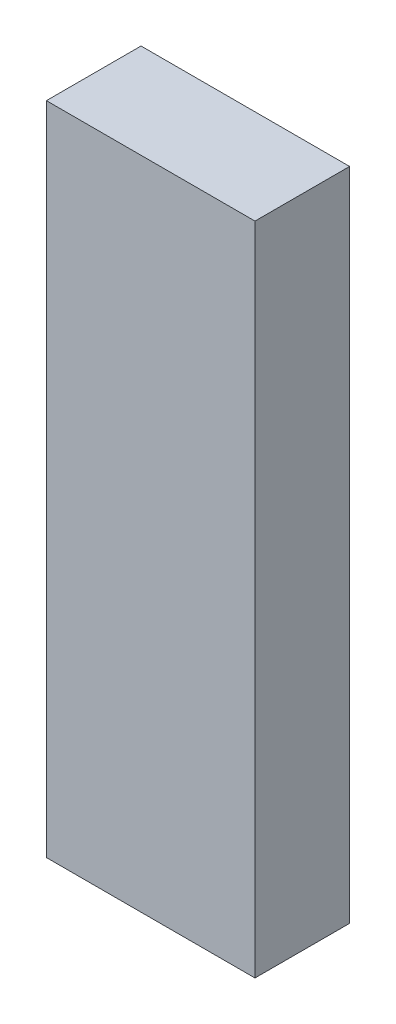
ISO-10303-21;
HEADER;
FILE_DESCRIPTION(('STEP AP214'),'2;1');
FILE_NAME('part.step','',(''),(''),'','','');
FILE_SCHEMA(('AUTOMOTIVE_DESIGN { 1 0 10303 214 1 1 1 1 }'));
ENDSEC;
DATA;
#1=APPLICATION_CONTEXT('core data for automotive mechanical design processes');
#2=APPLICATION_PROTOCOL_DEFINITION('international standard','automotive_design',2000,#1);
#3=PRODUCT_CONTEXT('',#1,'mechanical');
#4=PRODUCT('Part','Part','',(#3));
#5=PRODUCT_RELATED_PRODUCT_CATEGORY('part','',(#4));
#6=PRODUCT_DEFINITION_FORMATION('','',#4);
#7=PRODUCT_DEFINITION_CONTEXT('part definition',#1,'design');
#8=PRODUCT_DEFINITION('design','',#6,#7);
#9=PRODUCT_DEFINITION_SHAPE('','',#8);
#10=(LENGTH_UNIT() NAMED_UNIT(*) SI_UNIT(.MILLI.,.METRE.));
#11=(NAMED_UNIT(*) PLANE_ANGLE_UNIT() SI_UNIT($,.RADIAN.));
#12=(NAMED_UNIT(*) SI_UNIT($,.STERADIAN.) SOLID_ANGLE_UNIT());
#13=UNCERTAINTY_MEASURE_WITH_UNIT(LENGTH_MEASURE(1.E-05),#10,'distance_accuracy_value','');
#14=(GEOMETRIC_REPRESENTATION_CONTEXT(3) GLOBAL_UNCERTAINTY_ASSIGNED_CONTEXT((#13)) GLOBAL_UNIT_ASSIGNED_CONTEXT((#10,
#11,#12)) REPRESENTATION_CONTEXT('',''));
#15=CARTESIAN_POINT('',(0.,0.,0.));
#16=DIRECTION('',(0.,0.,1.));
#17=DIRECTION('',(1.,0.,0.));
#18=AXIS2_PLACEMENT_3D('',#15,#16,#17);
#19=CARTESIAN_POINT('',(0.,169.7,0.));
#20=DIRECTION('',(1.,0.,0.));
#21=DIRECTION('',(0.,0.,-1.));
#22=AXIS2_PLACEMENT_3D('',#19,#20,#21);
#23=PLANE('',#22);
#24=DIRECTION('',(0.,0.,1.));
#25=VECTOR('',#24,1.);
#26=CARTESIAN_POINT('',(0.,0.,0.));
#27=LINE('',#26,#25);
#28=CARTESIAN_POINT('',(0.,0.,-24.5));
#29=VERTEX_POINT('',#28);
#30=CARTESIAN_POINT('',(0.,0.,0.));
#31=VERTEX_POINT('',#30);
#32=EDGE_CURVE('E107',#29,#31,#27,.T.);
#33=ORIENTED_EDGE('',*,*,#32,.T.);
#34=DIRECTION('',(0.,-1.,0.));
#35=VECTOR('',#34,1.);
#36=CARTESIAN_POINT('',(0.,169.7,0.));
#37=LINE('',#36,#35);
#38=CARTESIAN_POINT('',(0.,169.7,0.));
#39=VERTEX_POINT('',#38);
#40=EDGE_CURVE('E11',#39,#31,#37,.T.);
#41=ORIENTED_EDGE('',*,*,#40,.F.);
#42=DIRECTION('',(0.,0.,1.));
#43=VECTOR('',#42,1.);
#44=CARTESIAN_POINT('',(0.,169.7,0.));
#45=LINE('',#44,#43);
#46=CARTESIAN_POINT('',(0.,169.7,-24.5));
#47=VERTEX_POINT('',#46);
#48=EDGE_CURVE('E91',#47,#39,#45,.T.);
#49=ORIENTED_EDGE('',*,*,#48,.F.);
#50=DIRECTION('',(0.,-1.,0.));
#51=VECTOR('',#50,1.);
#52=CARTESIAN_POINT('',(0.,169.7,-24.5));
#53=LINE('',#52,#51);
#54=EDGE_CURVE('E103',#47,#29,#53,.T.);
#55=ORIENTED_EDGE('',*,*,#54,.T.);
#56=EDGE_LOOP('',(#33,#41,#49,#55));
#57=FACE_BOUND('',#56,.T.);
#58=ADVANCED_FACE('F39',(#57),#23,.F.);
#59=CARTESIAN_POINT('',(0.,169.7,0.));
#60=DIRECTION('',(0.,0.,-1.));
#61=DIRECTION('',(-1.,0.,0.));
#62=AXIS2_PLACEMENT_3D('',#59,#60,#61);
#63=PLANE('',#62);
#64=DIRECTION('',(1.,0.,0.));
#65=VECTOR('',#64,1.);
#66=CARTESIAN_POINT('',(0.,0.,0.));
#67=LINE('',#66,#65);
#68=CARTESIAN_POINT('',(54.,0.,0.));
#69=VERTEX_POINT('',#68);
#70=EDGE_CURVE('E96',#31,#69,#67,.T.);
#71=ORIENTED_EDGE('',*,*,#70,.T.);
#72=DIRECTION('',(0.,-1.,0.));
#73=VECTOR('',#72,1.);
#74=CARTESIAN_POINT('',(54.,169.7,0.));
#75=LINE('',#74,#73);
#76=CARTESIAN_POINT('',(54.,169.7,0.));
#77=VERTEX_POINT('',#76);
#78=EDGE_CURVE('E48',#77,#69,#75,.T.);
#79=ORIENTED_EDGE('',*,*,#78,.F.);
#80=DIRECTION('',(1.,0.,0.));
#81=VECTOR('',#80,1.);
#82=CARTESIAN_POINT('',(0.,169.7,0.));
#83=LINE('',#82,#81);
#84=EDGE_CURVE('E86',#39,#77,#83,.T.);
#85=ORIENTED_EDGE('',*,*,#84,.F.);
#86=ORIENTED_EDGE('',*,*,#40,.T.);
#87=EDGE_LOOP('',(#71,#79,#85,#86));
#88=FACE_BOUND('',#87,.T.);
#89=ADVANCED_FACE('F95',(#88),#63,.F.);
#90=CARTESIAN_POINT('',(54.,169.7,0.));
#91=DIRECTION('',(-1.,0.,0.));
#92=DIRECTION('',(0.,0.,1.));
#93=AXIS2_PLACEMENT_3D('',#90,#91,#92);
#94=PLANE('',#93);
#95=DIRECTION('',(0.,0.,-1.));
#96=VECTOR('',#95,1.);
#97=CARTESIAN_POINT('',(54.,0.,0.));
#98=LINE('',#97,#96);
#99=CARTESIAN_POINT('',(54.,0.,-24.5));
#100=VERTEX_POINT('',#99);
#101=EDGE_CURVE('E73',#69,#100,#98,.T.);
#102=ORIENTED_EDGE('',*,*,#101,.T.);
#103=DIRECTION('',(0.,-1.,0.));
#104=VECTOR('',#103,1.);
#105=CARTESIAN_POINT('',(54.,169.7,-24.5));
#106=LINE('',#105,#104);
#107=CARTESIAN_POINT('',(54.,169.7,-24.5));
#108=VERTEX_POINT('',#107);
#109=EDGE_CURVE('E98',#108,#100,#106,.T.);
#110=ORIENTED_EDGE('',*,*,#109,.F.);
#111=DIRECTION('',(0.,0.,-1.));
#112=VECTOR('',#111,1.);
#113=CARTESIAN_POINT('',(54.,169.7,0.));
#114=LINE('',#113,#112);
#115=EDGE_CURVE('E89',#77,#108,#114,.T.);
#116=ORIENTED_EDGE('',*,*,#115,.F.);
#117=ORIENTED_EDGE('',*,*,#78,.T.);
#118=EDGE_LOOP('',(#102,#110,#116,#117));
#119=FACE_BOUND('',#118,.T.);
#120=ADVANCED_FACE('F99',(#119),#94,.F.);
#121=CARTESIAN_POINT('',(0.,169.7,-24.5));
#122=DIRECTION('',(0.,0.,1.));
#123=DIRECTION('',(1.,0.,0.));
#124=AXIS2_PLACEMENT_3D('',#121,#122,#123);
#125=PLANE('',#124);
#126=DIRECTION('',(-1.,0.,0.));
#127=VECTOR('',#126,1.);
#128=CARTESIAN_POINT('',(0.,0.,-24.5));
#129=LINE('',#128,#127);
#130=EDGE_CURVE('E79',#100,#29,#129,.T.);
#131=ORIENTED_EDGE('',*,*,#130,.T.);
#132=ORIENTED_EDGE('',*,*,#54,.F.);
#133=DIRECTION('',(-1.,0.,0.));
#134=VECTOR('',#133,1.);
#135=CARTESIAN_POINT('',(0.,169.7,-24.5));
#136=LINE('',#135,#134);
#137=EDGE_CURVE('E56',#108,#47,#136,.T.);
#138=ORIENTED_EDGE('',*,*,#137,.F.);
#139=ORIENTED_EDGE('',*,*,#109,.T.);
#140=EDGE_LOOP('',(#131,#132,#138,#139));
#141=FACE_BOUND('',#140,.T.);
#142=ADVANCED_FACE('F120',(#141),#125,.F.);
#143=CARTESIAN_POINT('',(0.,169.7,0.));
#144=DIRECTION('',(0.,-1.,0.));
#145=DIRECTION('',(0.,0.,-1.));
#146=AXIS2_PLACEMENT_3D('',#143,#144,#145);
#147=PLANE('',#146);
#148=ORIENTED_EDGE('',*,*,#48,.T.);
#149=ORIENTED_EDGE('',*,*,#84,.T.);
#150=ORIENTED_EDGE('',*,*,#115,.T.);
#151=ORIENTED_EDGE('',*,*,#137,.T.);
#152=EDGE_LOOP('',(#148,#149,#150,#151));
#153=FACE_BOUND('',#152,.T.);
#154=ADVANCED_FACE('F87',(#153),#147,.F.);
#155=CARTESIAN_POINT('',(0.,0.,0.));
#156=DIRECTION('',(0.,-1.,0.));
#157=DIRECTION('',(0.,0.,-1.));
#158=AXIS2_PLACEMENT_3D('',#155,#156,#157);
#159=PLANE('',#158);
#160=ORIENTED_EDGE('',*,*,#32,.F.);
#161=ORIENTED_EDGE('',*,*,#130,.F.);
#162=ORIENTED_EDGE('',*,*,#101,.F.);
#163=ORIENTED_EDGE('',*,*,#70,.F.);
#164=EDGE_LOOP('',(#160,#161,#162,#163));
#165=FACE_BOUND('',#164,.T.);
#166=ADVANCED_FACE('F123',(#165),#159,.T.);
#167=CLOSED_SHELL('',(#58,#89,#120,#142,#154,#166));
#168=MANIFOLD_SOLID_BREP('B2',#167);
#169=ADVANCED_BREP_SHAPE_REPRESENTATION('',(#18,#168),#14);
#170=SHAPE_DEFINITION_REPRESENTATION(#9,#169);
ENDSEC;
END-ISO-10303-21;
